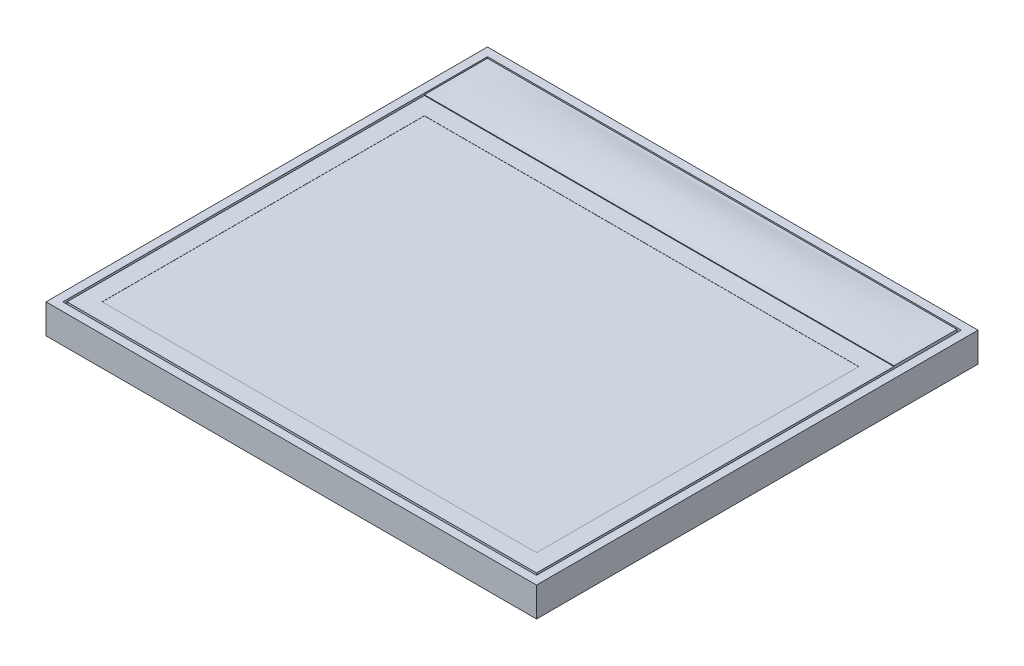
ISO-10303-21;
HEADER;
FILE_DESCRIPTION(('STEP AP214'),'2;1');
FILE_NAME('part.step','',(''),(''),'','','');
FILE_SCHEMA(('AUTOMOTIVE_DESIGN { 1 0 10303 214 1 1 1 1 }'));
ENDSEC;
DATA;
#1=APPLICATION_CONTEXT('core data for automotive mechanical design processes');
#2=APPLICATION_PROTOCOL_DEFINITION('international standard','automotive_design',2000,#1);
#3=PRODUCT_CONTEXT('',#1,'mechanical');
#4=PRODUCT('Part','Part','',(#3));
#5=PRODUCT_RELATED_PRODUCT_CATEGORY('part','',(#4));
#6=PRODUCT_DEFINITION_FORMATION('','',#4);
#7=PRODUCT_DEFINITION_CONTEXT('part definition',#1,'design');
#8=PRODUCT_DEFINITION('design','',#6,#7);
#9=PRODUCT_DEFINITION_SHAPE('','',#8);
#10=(LENGTH_UNIT() NAMED_UNIT(*) SI_UNIT(.MILLI.,.METRE.));
#11=(NAMED_UNIT(*) PLANE_ANGLE_UNIT() SI_UNIT($,.RADIAN.));
#12=(NAMED_UNIT(*) SI_UNIT($,.STERADIAN.) SOLID_ANGLE_UNIT());
#13=UNCERTAINTY_MEASURE_WITH_UNIT(LENGTH_MEASURE(1.E-05),#10,'distance_accuracy_value','');
#14=(GEOMETRIC_REPRESENTATION_CONTEXT(3) GLOBAL_UNCERTAINTY_ASSIGNED_CONTEXT((#13)) GLOBAL_UNIT_ASSIGNED_CONTEXT((#10,
#11,#12)) REPRESENTATION_CONTEXT('',''));
#15=CARTESIAN_POINT('',(0.,0.,0.));
#16=DIRECTION('',(0.,0.,1.));
#17=DIRECTION('',(1.,0.,0.));
#18=AXIS2_PLACEMENT_3D('',#15,#16,#17);
#19=CARTESIAN_POINT('',(-15.5,2.09,11.5));
#20=DIRECTION('',(0.,1.,0.));
#21=DIRECTION('',(0.,0.,1.));
#22=AXIS2_PLACEMENT_3D('',#19,#20,#21);
#23=PLANE('',#22);
#24=DIRECTION('',(0.,0.,-1.));
#25=VECTOR('',#24,1.);
#26=CARTESIAN_POINT('',(15.5,2.09,-11.5));
#27=LINE('',#26,#25);
#28=CARTESIAN_POINT('',(15.5,2.09,11.5));
#29=VERTEX_POINT('',#28);
#30=CARTESIAN_POINT('',(15.5,2.09,-11.5));
#31=VERTEX_POINT('',#30);
#32=EDGE_CURVE('E162',#29,#31,#27,.T.);
#33=ORIENTED_EDGE('',*,*,#32,.T.);
#34=DIRECTION('',(-1.,0.,0.));
#35=VECTOR('',#34,1.);
#36=CARTESIAN_POINT('',(-15.5,2.09,-11.5));
#37=LINE('',#36,#35);
#38=CARTESIAN_POINT('',(-15.5,2.09,-11.5));
#39=VERTEX_POINT('',#38);
#40=EDGE_CURVE('E143',#31,#39,#37,.T.);
#41=ORIENTED_EDGE('',*,*,#40,.T.);
#42=DIRECTION('',(0.,0.,1.));
#43=VECTOR('',#42,1.);
#44=CARTESIAN_POINT('',(-15.5,2.09,-11.5));
#45=LINE('',#44,#43);
#46=CARTESIAN_POINT('',(-15.5,2.09,11.5));
#47=VERTEX_POINT('',#46);
#48=EDGE_CURVE('E149',#39,#47,#45,.T.);
#49=ORIENTED_EDGE('',*,*,#48,.T.);
#50=DIRECTION('',(1.,0.,0.));
#51=VECTOR('',#50,1.);
#52=CARTESIAN_POINT('',(-15.5,2.09,11.5));
#53=LINE('',#52,#51);
#54=EDGE_CURVE('E209',#47,#29,#53,.T.);
#55=ORIENTED_EDGE('',*,*,#54,.T.);
#56=EDGE_LOOP('',(#33,#41,#49,#55));
#57=FACE_BOUND('',#56,.T.);
#58=ADVANCED_FACE('F17',(#57),#23,.T.);
#59=CARTESIAN_POINT('',(-16.75,2.15,-12.75));
#60=DIRECTION('',(0.,0.,-1.));
#61=DIRECTION('',(-1.,0.,0.));
#62=AXIS2_PLACEMENT_3D('',#59,#60,#61);
#63=PLANE('',#62);
#64=DIRECTION('',(0.,1.,0.));
#65=VECTOR('',#64,1.);
#66=CARTESIAN_POINT('',(16.75,2.15,-12.75));
#67=LINE('',#66,#65);
#68=CARTESIAN_POINT('',(16.75,2.15,-12.75));
#69=VERTEX_POINT('',#68);
#70=CARTESIAN_POINT('',(16.75,2.1,-12.75));
#71=VERTEX_POINT('',#70);
#72=EDGE_CURVE('E158',#69,#71,#67,.F.);
#73=ORIENTED_EDGE('',*,*,#72,.F.);
#74=DIRECTION('',(1.,0.,0.));
#75=VECTOR('',#74,1.);
#76=CARTESIAN_POINT('',(0.,2.15,-12.75));
#77=LINE('',#76,#75);
#78=CARTESIAN_POINT('',(-16.75,2.15,-12.75));
#79=VERTEX_POINT('',#78);
#80=EDGE_CURVE('E183',#79,#69,#77,.T.);
#81=ORIENTED_EDGE('',*,*,#80,.F.);
#82=DIRECTION('',(0.,1.,0.));
#83=VECTOR('',#82,1.);
#84=CARTESIAN_POINT('',(-16.75,2.15,-12.75));
#85=LINE('',#84,#83);
#86=CARTESIAN_POINT('',(-16.75,2.1,-12.75));
#87=VERTEX_POINT('',#86);
#88=EDGE_CURVE('E23',#87,#79,#85,.T.);
#89=ORIENTED_EDGE('',*,*,#88,.F.);
#90=DIRECTION('',(1.,0.,0.));
#91=VECTOR('',#90,1.);
#92=CARTESIAN_POINT('',(-16.75,2.1,-12.75));
#93=LINE('',#92,#91);
#94=EDGE_CURVE('E187',#71,#87,#93,.F.);
#95=ORIENTED_EDGE('',*,*,#94,.F.);
#96=EDGE_LOOP('',(#73,#81,#89,#95));
#97=FACE_BOUND('',#96,.T.);
#98=ADVANCED_FACE('F184',(#97),#63,.F.);
#99=CARTESIAN_POINT('',(-15.5,2.09,-11.5));
#100=DIRECTION('',(-1.,0.,0.));
#101=DIRECTION('',(0.,0.,1.));
#102=AXIS2_PLACEMENT_3D('',#99,#100,#101);
#103=PLANE('',#102);
#104=DIRECTION('',(0.,1.,0.));
#105=VECTOR('',#104,1.);
#106=CARTESIAN_POINT('',(-15.5,2.09,11.5));
#107=LINE('',#106,#105);
#108=CARTESIAN_POINT('',(-15.5,2.1,11.5));
#109=VERTEX_POINT('',#108);
#110=EDGE_CURVE('E154',#109,#47,#107,.F.);
#111=ORIENTED_EDGE('',*,*,#110,.T.);
#112=ORIENTED_EDGE('',*,*,#48,.F.);
#113=DIRECTION('',(0.,1.,0.));
#114=VECTOR('',#113,1.);
#115=CARTESIAN_POINT('',(-15.5,2.09,-11.5));
#116=LINE('',#115,#114);
#117=CARTESIAN_POINT('',(-15.5,2.1,-11.5));
#118=VERTEX_POINT('',#117);
#119=EDGE_CURVE('E152',#39,#118,#116,.T.);
#120=ORIENTED_EDGE('',*,*,#119,.T.);
#121=DIRECTION('',(0.,0.,1.));
#122=VECTOR('',#121,1.);
#123=CARTESIAN_POINT('',(-15.5,2.1,12.75));
#124=LINE('',#123,#122);
#125=EDGE_CURVE('E204',#109,#118,#124,.F.);
#126=ORIENTED_EDGE('',*,*,#125,.F.);
#127=EDGE_LOOP('',(#111,#112,#120,#126));
#128=FACE_BOUND('',#127,.T.);
#129=ADVANCED_FACE('F150',(#128),#103,.F.);
#130=CARTESIAN_POINT('',(-15.5,2.09,-11.5));
#131=DIRECTION('',(0.,0.,-1.));
#132=DIRECTION('',(-1.,0.,0.));
#133=AXIS2_PLACEMENT_3D('',#130,#131,#132);
#134=PLANE('',#133);
#135=ORIENTED_EDGE('',*,*,#119,.F.);
#136=ORIENTED_EDGE('',*,*,#40,.F.);
#137=DIRECTION('',(0.,1.,0.));
#138=VECTOR('',#137,1.);
#139=CARTESIAN_POINT('',(15.5,2.09,-11.5));
#140=LINE('',#139,#138);
#141=CARTESIAN_POINT('',(15.5,2.1,-11.5));
#142=VERTEX_POINT('',#141);
#143=EDGE_CURVE('E212',#31,#142,#140,.T.);
#144=ORIENTED_EDGE('',*,*,#143,.T.);
#145=DIRECTION('',(1.,0.,0.));
#146=VECTOR('',#145,1.);
#147=CARTESIAN_POINT('',(-16.75,2.1,-11.5));
#148=LINE('',#147,#146);
#149=EDGE_CURVE('E161',#118,#142,#148,.T.);
#150=ORIENTED_EDGE('',*,*,#149,.F.);
#151=EDGE_LOOP('',(#135,#136,#144,#150));
#152=FACE_BOUND('',#151,.T.);
#153=ADVANCED_FACE('F160',(#152),#134,.F.);
#154=CARTESIAN_POINT('',(15.5,2.09,-11.5));
#155=DIRECTION('',(1.,0.,0.));
#156=DIRECTION('',(0.,0.,-1.));
#157=AXIS2_PLACEMENT_3D('',#154,#155,#156);
#158=PLANE('',#157);
#159=ORIENTED_EDGE('',*,*,#143,.F.);
#160=ORIENTED_EDGE('',*,*,#32,.F.);
#161=DIRECTION('',(0.,1.,0.));
#162=VECTOR('',#161,1.);
#163=CARTESIAN_POINT('',(15.5,2.09,11.5));
#164=LINE('',#163,#162);
#165=CARTESIAN_POINT('',(15.5,2.1,11.5));
#166=VERTEX_POINT('',#165);
#167=EDGE_CURVE('E188',#29,#166,#164,.T.);
#168=ORIENTED_EDGE('',*,*,#167,.T.);
#169=DIRECTION('',(0.,0.,1.));
#170=VECTOR('',#169,1.);
#171=CARTESIAN_POINT('',(15.5,2.1,12.75));
#172=LINE('',#171,#170);
#173=EDGE_CURVE('E201',#142,#166,#172,.T.);
#174=ORIENTED_EDGE('',*,*,#173,.F.);
#175=EDGE_LOOP('',(#159,#160,#168,#174));
#176=FACE_BOUND('',#175,.T.);
#177=ADVANCED_FACE('F215',(#176),#158,.F.);
#178=CARTESIAN_POINT('',(-15.5,2.09,11.5));
#179=DIRECTION('',(0.,0.,1.));
#180=DIRECTION('',(1.,0.,0.));
#181=AXIS2_PLACEMENT_3D('',#178,#179,#180);
#182=PLANE('',#181);
#183=ORIENTED_EDGE('',*,*,#167,.F.);
#184=ORIENTED_EDGE('',*,*,#54,.F.);
#185=ORIENTED_EDGE('',*,*,#110,.F.);
#186=DIRECTION('',(1.,0.,0.));
#187=VECTOR('',#186,1.);
#188=CARTESIAN_POINT('',(-16.75,2.1,11.5));
#189=LINE('',#188,#187);
#190=EDGE_CURVE('E195',#166,#109,#189,.F.);
#191=ORIENTED_EDGE('',*,*,#190,.F.);
#192=EDGE_LOOP('',(#183,#184,#185,#191));
#193=FACE_BOUND('',#192,.T.);
#194=ADVANCED_FACE('F222',(#193),#182,.F.);
#195=CARTESIAN_POINT('',(-16.75,2.15,-17.25));
#196=CARTESIAN_POINT('',(-5.583333333333,2.15,-17.25));
#197=CARTESIAN_POINT('',(5.583333333333,2.15,-17.25));
#198=CARTESIAN_POINT('',(16.75,2.15,-17.25));
#199=CARTESIAN_POINT('',(-16.75,2.15,-15.75));
#200=CARTESIAN_POINT('',(-5.583333333333,2.683333333333,-15.75));
#201=CARTESIAN_POINT('',(5.583333333333,2.683333333333,-15.75));
#202=CARTESIAN_POINT('',(16.75,2.15,-15.75));
#203=CARTESIAN_POINT('',(-16.75,2.15,-14.25));
#204=CARTESIAN_POINT('',(-5.583333333333,2.683333333333,-14.25));
#205=CARTESIAN_POINT('',(5.583333333333,2.683333333333,-14.25));
#206=CARTESIAN_POINT('',(16.75,2.15,-14.25));
#207=CARTESIAN_POINT('',(-16.75,2.15,-12.75));
#208=CARTESIAN_POINT('',(-5.583333333333,2.15,-12.75));
#209=CARTESIAN_POINT('',(5.583333333333,2.15,-12.75));
#210=CARTESIAN_POINT('',(16.75,2.15,-12.75));
#211=B_SPLINE_SURFACE_WITH_KNOTS('',3,3,((#195,#196,#197,#198),(#199,#200,#201,#202),(#203,#204,
#205,#206),(#207,#208,#209,#210)),.UNSPECIFIED.,.F.,.F.,.F.,(4,4),(4,4),(0.,1.),(0.,1.),.UNSPECIFIED.);
#212=DIRECTION('',(-1.,0.,0.));
#213=VECTOR('',#212,1.);
#214=CARTESIAN_POINT('',(-16.75,2.15,-17.25));
#215=LINE('',#214,#213);
#216=CARTESIAN_POINT('',(-16.75,2.15,-17.25));
#217=VERTEX_POINT('',#216);
#218=CARTESIAN_POINT('',(16.75,2.15,-17.25));
#219=VERTEX_POINT('',#218);
#220=EDGE_CURVE('E191',#217,#219,#215,.F.);
#221=DIRECTION('',(0.,0.,1.));
#222=VECTOR('',#221,1.);
#223=CARTESIAN_POINT('',(-16.75,2.15,-17.25));
#224=LINE('',#223,#222);
#225=EDGE_CURVE('E176',#79,#217,#224,.F.);
#226=DIRECTION('',(0.,0.,-1.));
#227=VECTOR('',#226,1.);
#228=CARTESIAN_POINT('',(16.75,2.15,-17.25));
#229=LINE('',#228,#227);
#230=EDGE_CURVE('E517',#219,#69,#229,.F.);
#231=ORIENTED_EDGE('',*,*,#220,.F.);
#232=ORIENTED_EDGE('',*,*,#225,.F.);
#233=ORIENTED_EDGE('',*,*,#80,.T.);
#234=ORIENTED_EDGE('',*,*,#230,.F.);
#235=EDGE_LOOP('',(#231,#232,#233,#234));
#236=FACE_BOUND('',#235,.T.);
#237=ADVANCED_FACE('F19',(#236),#211,.T.);
#238=CARTESIAN_POINT('',(-16.75,2.1,12.75));
#239=DIRECTION('',(0.,1.,0.));
#240=DIRECTION('',(0.,0.,1.));
#241=AXIS2_PLACEMENT_3D('',#238,#239,#240);
#242=PLANE('',#241);
#243=ORIENTED_EDGE('',*,*,#173,.T.);
#244=ORIENTED_EDGE('',*,*,#190,.T.);
#245=ORIENTED_EDGE('',*,*,#125,.T.);
#246=ORIENTED_EDGE('',*,*,#149,.T.);
#247=EDGE_LOOP('',(#243,#244,#245,#246));
#248=FACE_BOUND('',#247,.T.);
#249=DIRECTION('',(1.,0.,0.));
#250=VECTOR('',#249,1.);
#251=CARTESIAN_POINT('',(-16.75,2.1,12.75));
#252=LINE('',#251,#250);
#253=CARTESIAN_POINT('',(16.75,2.1,12.75));
#254=VERTEX_POINT('',#253);
#255=CARTESIAN_POINT('',(-16.75,2.1,12.75));
#256=VERTEX_POINT('',#255);
#257=EDGE_CURVE('E503',#254,#256,#252,.F.);
#258=ORIENTED_EDGE('',*,*,#257,.F.);
#259=DIRECTION('',(0.,0.,-1.));
#260=VECTOR('',#259,1.);
#261=CARTESIAN_POINT('',(16.75,2.1,-17.25));
#262=LINE('',#261,#260);
#263=EDGE_CURVE('E515',#71,#254,#262,.F.);
#264=ORIENTED_EDGE('',*,*,#263,.F.);
#265=ORIENTED_EDGE('',*,*,#94,.T.);
#266=DIRECTION('',(0.,0.,1.));
#267=VECTOR('',#266,1.);
#268=CARTESIAN_POINT('',(-16.75,2.1,-17.25));
#269=LINE('',#268,#267);
#270=EDGE_CURVE('E179',#256,#87,#269,.F.);
#271=ORIENTED_EDGE('',*,*,#270,.F.);
#272=EDGE_LOOP('',(#258,#264,#265,#271));
#273=FACE_BOUND('',#272,.T.);
#274=ADVANCED_FACE('F219',(#248,#273),#242,.T.);
#275=CARTESIAN_POINT('',(-16.75,0.3,-17.25));
#276=DIRECTION('',(-1.,0.,0.));
#277=DIRECTION('',(0.,0.,1.));
#278=AXIS2_PLACEMENT_3D('',#275,#276,#277);
#279=PLANE('',#278);
#280=ORIENTED_EDGE('',*,*,#88,.T.);
#281=ORIENTED_EDGE('',*,*,#225,.T.);
#282=DIRECTION('',(0.,1.,0.));
#283=VECTOR('',#282,1.);
#284=CARTESIAN_POINT('',(-16.75,0.3,-17.25));
#285=LINE('',#284,#283);
#286=CARTESIAN_POINT('',(-16.75,0.6,-17.25));
#287=VERTEX_POINT('',#286);
#288=EDGE_CURVE('E192',#287,#217,#285,.T.);
#289=ORIENTED_EDGE('',*,*,#288,.F.);
#290=DIRECTION('',(0.,0.,1.));
#291=VECTOR('',#290,1.);
#292=CARTESIAN_POINT('',(-16.75,0.6,13.5));
#293=LINE('',#292,#291);
#294=CARTESIAN_POINT('',(-16.75,0.6,12.75));
#295=VERTEX_POINT('',#294);
#296=EDGE_CURVE('E499',#295,#287,#293,.F.);
#297=ORIENTED_EDGE('',*,*,#296,.F.);
#298=DIRECTION('',(0.,1.,0.));
#299=VECTOR('',#298,1.);
#300=CARTESIAN_POINT('',(-16.75,0.3,12.75));
#301=LINE('',#300,#299);
#302=EDGE_CURVE('E500',#256,#295,#301,.F.);
#303=ORIENTED_EDGE('',*,*,#302,.F.);
#304=ORIENTED_EDGE('',*,*,#270,.T.);
#305=EDGE_LOOP('',(#280,#281,#289,#297,#303,#304));
#306=FACE_BOUND('',#305,.T.);
#307=ADVANCED_FACE('F173',(#306),#279,.T.);
#308=CARTESIAN_POINT('',(-16.75,0.3,-17.25));
#309=DIRECTION('',(0.,0.,-1.));
#310=DIRECTION('',(-1.,0.,0.));
#311=AXIS2_PLACEMENT_3D('',#308,#309,#310);
#312=PLANE('',#311);
#313=ORIENTED_EDGE('',*,*,#288,.T.);
#314=ORIENTED_EDGE('',*,*,#220,.T.);
#315=DIRECTION('',(0.,1.,0.));
#316=VECTOR('',#315,1.);
#317=CARTESIAN_POINT('',(16.75,0.3,-17.25));
#318=LINE('',#317,#316);
#319=CARTESIAN_POINT('',(16.75,0.6,-17.25));
#320=VERTEX_POINT('',#319);
#321=EDGE_CURVE('E519',#320,#219,#318,.T.);
#322=ORIENTED_EDGE('',*,*,#321,.F.);
#323=DIRECTION('',(1.,0.,0.));
#324=VECTOR('',#323,1.);
#325=CARTESIAN_POINT('',(-17.5,0.6,-17.25));
#326=LINE('',#325,#324);
#327=EDGE_CURVE('E497',#287,#320,#326,.T.);
#328=ORIENTED_EDGE('',*,*,#327,.F.);
#329=EDGE_LOOP('',(#313,#314,#322,#328));
#330=FACE_BOUND('',#329,.T.);
#331=ADVANCED_FACE('F286',(#330),#312,.T.);
#332=CARTESIAN_POINT('',(16.75,0.3,-17.25));
#333=DIRECTION('',(1.,0.,0.));
#334=DIRECTION('',(0.,0.,-1.));
#335=AXIS2_PLACEMENT_3D('',#332,#333,#334);
#336=PLANE('',#335);
#337=ORIENTED_EDGE('',*,*,#72,.T.);
#338=ORIENTED_EDGE('',*,*,#263,.T.);
#339=DIRECTION('',(0.,1.,0.));
#340=VECTOR('',#339,1.);
#341=CARTESIAN_POINT('',(16.75,0.3,12.75));
#342=LINE('',#341,#340);
#343=CARTESIAN_POINT('',(16.75,0.6,12.75));
#344=VERTEX_POINT('',#343);
#345=EDGE_CURVE('E508',#344,#254,#342,.T.);
#346=ORIENTED_EDGE('',*,*,#345,.F.);
#347=DIRECTION('',(0.,0.,1.));
#348=VECTOR('',#347,1.);
#349=CARTESIAN_POINT('',(16.75,0.6,13.5));
#350=LINE('',#349,#348);
#351=EDGE_CURVE('E505',#320,#344,#350,.T.);
#352=ORIENTED_EDGE('',*,*,#351,.F.);
#353=ORIENTED_EDGE('',*,*,#321,.T.);
#354=ORIENTED_EDGE('',*,*,#230,.T.);
#355=EDGE_LOOP('',(#337,#338,#346,#352,#353,#354));
#356=FACE_BOUND('',#355,.T.);
#357=ADVANCED_FACE('F282',(#356),#336,.T.);
#358=CARTESIAN_POINT('',(-16.75,0.3,12.75));
#359=DIRECTION('',(0.,0.,1.));
#360=DIRECTION('',(1.,0.,0.));
#361=AXIS2_PLACEMENT_3D('',#358,#359,#360);
#362=PLANE('',#361);
#363=ORIENTED_EDGE('',*,*,#345,.T.);
#364=ORIENTED_EDGE('',*,*,#257,.T.);
#365=ORIENTED_EDGE('',*,*,#302,.T.);
#366=DIRECTION('',(1.,0.,0.));
#367=VECTOR('',#366,1.);
#368=CARTESIAN_POINT('',(-17.5,0.6,12.75));
#369=LINE('',#368,#367);
#370=EDGE_CURVE('E523',#344,#295,#369,.F.);
#371=ORIENTED_EDGE('',*,*,#370,.F.);
#372=EDGE_LOOP('',(#363,#364,#365,#371));
#373=FACE_BOUND('',#372,.T.);
#374=ADVANCED_FACE('F278',(#373),#362,.T.);
#375=CARTESIAN_POINT('',(-17.5,0.6,13.5));
#376=DIRECTION('',(0.,1.,0.));
#377=DIRECTION('',(0.,0.,1.));
#378=AXIS2_PLACEMENT_3D('',#375,#376,#377);
#379=PLANE('',#378);
#380=DIRECTION('',(0.,0.,1.));
#381=VECTOR('',#380,1.);
#382=CARTESIAN_POINT('',(16.9,0.6,-18.));
#383=LINE('',#382,#381);
#384=CARTESIAN_POINT('',(16.9,0.6,-17.4));
#385=VERTEX_POINT('',#384);
#386=CARTESIAN_POINT('',(16.9,0.6,12.9));
#387=VERTEX_POINT('',#386);
#388=EDGE_CURVE('E533',#385,#387,#383,.T.);
#389=ORIENTED_EDGE('',*,*,#388,.F.);
#390=DIRECTION('',(1.,0.,0.));
#391=VECTOR('',#390,1.);
#392=CARTESIAN_POINT('',(-17.5,0.6,-17.4));
#393=LINE('',#392,#391);
#394=CARTESIAN_POINT('',(-16.9,0.6,-17.4));
#395=VERTEX_POINT('',#394);
#396=EDGE_CURVE('E528',#395,#385,#393,.T.);
#397=ORIENTED_EDGE('',*,*,#396,.F.);
#398=DIRECTION('',(0.,0.,-1.));
#399=VECTOR('',#398,1.);
#400=CARTESIAN_POINT('',(-16.9,0.6,-18.));
#401=LINE('',#400,#399);
#402=CARTESIAN_POINT('',(-16.9,0.6,12.9));
#403=VERTEX_POINT('',#402);
#404=EDGE_CURVE('E524',#403,#395,#401,.T.);
#405=ORIENTED_EDGE('',*,*,#404,.F.);
#406=DIRECTION('',(-1.,0.,0.));
#407=VECTOR('',#406,1.);
#408=CARTESIAN_POINT('',(-17.5,0.6,12.9));
#409=LINE('',#408,#407);
#410=EDGE_CURVE('E538',#387,#403,#409,.T.);
#411=ORIENTED_EDGE('',*,*,#410,.F.);
#412=EDGE_LOOP('',(#389,#397,#405,#411));
#413=FACE_BOUND('',#412,.T.);
#414=ORIENTED_EDGE('',*,*,#351,.T.);
#415=ORIENTED_EDGE('',*,*,#370,.T.);
#416=ORIENTED_EDGE('',*,*,#296,.T.);
#417=ORIENTED_EDGE('',*,*,#327,.T.);
#418=EDGE_LOOP('',(#414,#415,#416,#417));
#419=FACE_BOUND('',#418,.T.);
#420=ADVANCED_FACE('F274',(#413,#419),#379,.T.);
#421=CARTESIAN_POINT('',(-16.9,2.1,-18.));
#422=DIRECTION('',(1.,0.,0.));
#423=DIRECTION('',(0.,0.,-1.));
#424=AXIS2_PLACEMENT_3D('',#421,#422,#423);
#425=PLANE('',#424);
#426=DIRECTION('',(0.,0.,1.));
#427=VECTOR('',#426,1.);
#428=CARTESIAN_POINT('',(-16.9,2.1,13.5));
#429=LINE('',#428,#427);
#430=CARTESIAN_POINT('',(-16.9,2.1,12.9));
#431=VERTEX_POINT('',#430);
#432=CARTESIAN_POINT('',(-16.9,2.1,-17.4));
#433=VERTEX_POINT('',#432);
#434=EDGE_CURVE('E545',#431,#433,#429,.F.);
#435=ORIENTED_EDGE('',*,*,#434,.F.);
#436=DIRECTION('',(0.,1.,0.));
#437=VECTOR('',#436,1.);
#438=CARTESIAN_POINT('',(-16.9,2.1,12.9));
#439=LINE('',#438,#437);
#440=EDGE_CURVE('E540',#403,#431,#439,.T.);
#441=ORIENTED_EDGE('',*,*,#440,.F.);
#442=ORIENTED_EDGE('',*,*,#404,.T.);
#443=DIRECTION('',(0.,1.,0.));
#444=VECTOR('',#443,1.);
#445=CARTESIAN_POINT('',(-16.9,2.1,-17.4));
#446=LINE('',#445,#444);
#447=EDGE_CURVE('E530',#433,#395,#446,.F.);
#448=ORIENTED_EDGE('',*,*,#447,.F.);
#449=EDGE_LOOP('',(#435,#441,#442,#448));
#450=FACE_BOUND('',#449,.T.);
#451=ADVANCED_FACE('F270',(#450),#425,.T.);
#452=CARTESIAN_POINT('',(-17.5,2.1,-17.4));
#453=DIRECTION('',(0.,0.,1.));
#454=DIRECTION('',(1.,0.,0.));
#455=AXIS2_PLACEMENT_3D('',#452,#453,#454);
#456=PLANE('',#455);
#457=DIRECTION('',(1.,0.,0.));
#458=VECTOR('',#457,1.);
#459=CARTESIAN_POINT('',(-17.5,2.1,-17.4));
#460=LINE('',#459,#458);
#461=CARTESIAN_POINT('',(16.9,2.1,-17.4));
#462=VERTEX_POINT('',#461);
#463=EDGE_CURVE('E547',#433,#462,#460,.T.);
#464=ORIENTED_EDGE('',*,*,#463,.F.);
#465=ORIENTED_EDGE('',*,*,#447,.T.);
#466=ORIENTED_EDGE('',*,*,#396,.T.);
#467=DIRECTION('',(0.,1.,0.));
#468=VECTOR('',#467,1.);
#469=CARTESIAN_POINT('',(16.9,2.1,-17.4));
#470=LINE('',#469,#468);
#471=EDGE_CURVE('E535',#462,#385,#470,.F.);
#472=ORIENTED_EDGE('',*,*,#471,.F.);
#473=EDGE_LOOP('',(#464,#465,#466,#472));
#474=FACE_BOUND('',#473,.T.);
#475=ADVANCED_FACE('F266',(#474),#456,.T.);
#476=CARTESIAN_POINT('',(16.9,2.1,-18.));
#477=DIRECTION('',(-1.,0.,0.));
#478=DIRECTION('',(0.,0.,1.));
#479=AXIS2_PLACEMENT_3D('',#476,#477,#478);
#480=PLANE('',#479);
#481=DIRECTION('',(0.,0.,1.));
#482=VECTOR('',#481,1.);
#483=CARTESIAN_POINT('',(16.9,2.1,13.5));
#484=LINE('',#483,#482);
#485=CARTESIAN_POINT('',(16.9,2.1,12.9));
#486=VERTEX_POINT('',#485);
#487=EDGE_CURVE('E549',#462,#486,#484,.T.);
#488=ORIENTED_EDGE('',*,*,#487,.F.);
#489=ORIENTED_EDGE('',*,*,#471,.T.);
#490=ORIENTED_EDGE('',*,*,#388,.T.);
#491=DIRECTION('',(0.,1.,0.));
#492=VECTOR('',#491,1.);
#493=CARTESIAN_POINT('',(16.9,2.1,12.9));
#494=LINE('',#493,#492);
#495=EDGE_CURVE('E542',#486,#387,#494,.F.);
#496=ORIENTED_EDGE('',*,*,#495,.F.);
#497=EDGE_LOOP('',(#488,#489,#490,#496));
#498=FACE_BOUND('',#497,.T.);
#499=ADVANCED_FACE('F262',(#498),#480,.T.);
#500=CARTESIAN_POINT('',(-17.5,2.1,12.9));
#501=DIRECTION('',(0.,0.,-1.));
#502=DIRECTION('',(-1.,0.,0.));
#503=AXIS2_PLACEMENT_3D('',#500,#501,#502);
#504=PLANE('',#503);
#505=DIRECTION('',(1.,0.,0.));
#506=VECTOR('',#505,1.);
#507=CARTESIAN_POINT('',(-17.5,2.1,12.9));
#508=LINE('',#507,#506);
#509=EDGE_CURVE('E551',#486,#431,#508,.F.);
#510=ORIENTED_EDGE('',*,*,#509,.F.);
#511=ORIENTED_EDGE('',*,*,#495,.T.);
#512=ORIENTED_EDGE('',*,*,#410,.T.);
#513=ORIENTED_EDGE('',*,*,#440,.T.);
#514=EDGE_LOOP('',(#510,#511,#512,#513));
#515=FACE_BOUND('',#514,.T.);
#516=ADVANCED_FACE('F258',(#515),#504,.T.);
#517=CARTESIAN_POINT('',(-17.5,2.1,13.5));
#518=DIRECTION('',(0.,1.,0.));
#519=DIRECTION('',(0.,0.,1.));
#520=AXIS2_PLACEMENT_3D('',#517,#518,#519);
#521=PLANE('',#520);
#522=DIRECTION('',(0.,0.,1.));
#523=VECTOR('',#522,1.);
#524=CARTESIAN_POINT('',(17.5,2.1,-18.));
#525=LINE('',#524,#523);
#526=CARTESIAN_POINT('',(17.5,2.1,13.5));
#527=VERTEX_POINT('',#526);
#528=CARTESIAN_POINT('',(17.5,2.1,-18.));
#529=VERTEX_POINT('',#528);
#530=EDGE_CURVE('E559',#527,#529,#525,.F.);
#531=ORIENTED_EDGE('',*,*,#530,.T.);
#532=DIRECTION('',(1.,0.,0.));
#533=VECTOR('',#532,1.);
#534=CARTESIAN_POINT('',(-17.5,2.1,-18.));
#535=LINE('',#534,#533);
#536=CARTESIAN_POINT('',(-17.5,2.1,-18.));
#537=VERTEX_POINT('',#536);
#538=EDGE_CURVE('E564',#529,#537,#535,.F.);
#539=ORIENTED_EDGE('',*,*,#538,.T.);
#540=DIRECTION('',(0.,0.,-1.));
#541=VECTOR('',#540,1.);
#542=CARTESIAN_POINT('',(-17.5,2.1,-18.));
#543=LINE('',#542,#541);
#544=CARTESIAN_POINT('',(-17.5,2.1,13.5));
#545=VERTEX_POINT('',#544);
#546=EDGE_CURVE('E567',#537,#545,#543,.F.);
#547=ORIENTED_EDGE('',*,*,#546,.T.);
#548=DIRECTION('',(-1.,0.,0.));
#549=VECTOR('',#548,1.);
#550=CARTESIAN_POINT('',(-17.5,2.1,13.5));
#551=LINE('',#550,#549);
#552=EDGE_CURVE('E554',#545,#527,#551,.F.);
#553=ORIENTED_EDGE('',*,*,#552,.T.);
#554=EDGE_LOOP('',(#531,#539,#547,#553));
#555=FACE_BOUND('',#554,.T.);
#556=ORIENTED_EDGE('',*,*,#487,.T.);
#557=ORIENTED_EDGE('',*,*,#509,.T.);
#558=ORIENTED_EDGE('',*,*,#434,.T.);
#559=ORIENTED_EDGE('',*,*,#463,.T.);
#560=EDGE_LOOP('',(#556,#557,#558,#559));
#561=FACE_BOUND('',#560,.T.);
#562=ADVANCED_FACE('F254',(#555,#561),#521,.T.);
#563=CARTESIAN_POINT('',(-17.5,2.1,13.5));
#564=DIRECTION('',(0.,0.,-1.));
#565=DIRECTION('',(-1.,0.,0.));
#566=AXIS2_PLACEMENT_3D('',#563,#564,#565);
#567=PLANE('',#566);
#568=DIRECTION('',(0.,1.,0.));
#569=VECTOR('',#568,1.);
#570=CARTESIAN_POINT('',(17.5,2.1,13.5));
#571=LINE('',#570,#569);
#572=CARTESIAN_POINT('',(17.5,0.,13.5));
#573=VERTEX_POINT('',#572);
#574=EDGE_CURVE('E556',#573,#527,#571,.T.);
#575=ORIENTED_EDGE('',*,*,#574,.T.);
#576=ORIENTED_EDGE('',*,*,#552,.F.);
#577=DIRECTION('',(0.,1.,0.));
#578=VECTOR('',#577,1.);
#579=CARTESIAN_POINT('',(-17.5,2.1,13.5));
#580=LINE('',#579,#578);
#581=CARTESIAN_POINT('',(-17.5,0.,13.5));
#582=VERTEX_POINT('',#581);
#583=EDGE_CURVE('E570',#545,#582,#580,.F.);
#584=ORIENTED_EDGE('',*,*,#583,.T.);
#585=DIRECTION('',(1.,0.,0.));
#586=VECTOR('',#585,1.);
#587=CARTESIAN_POINT('',(-17.5,0.,13.5));
#588=LINE('',#587,#586);
#589=EDGE_CURVE('E573',#582,#573,#588,.T.);
#590=ORIENTED_EDGE('',*,*,#589,.T.);
#591=EDGE_LOOP('',(#575,#576,#584,#590));
#592=FACE_BOUND('',#591,.T.);
#593=ADVANCED_FACE('F250',(#592),#567,.F.);
#594=CARTESIAN_POINT('',(17.5,2.1,-18.));
#595=DIRECTION('',(-1.,0.,0.));
#596=DIRECTION('',(0.,0.,1.));
#597=AXIS2_PLACEMENT_3D('',#594,#595,#596);
#598=PLANE('',#597);
#599=DIRECTION('',(0.,1.,0.));
#600=VECTOR('',#599,1.);
#601=CARTESIAN_POINT('',(17.5,2.1,-18.));
#602=LINE('',#601,#600);
#603=CARTESIAN_POINT('',(17.5,0.,-18.));
#604=VERTEX_POINT('',#603);
#605=EDGE_CURVE('E561',#604,#529,#602,.T.);
#606=ORIENTED_EDGE('',*,*,#605,.T.);
#607=ORIENTED_EDGE('',*,*,#530,.F.);
#608=ORIENTED_EDGE('',*,*,#574,.F.);
#609=DIRECTION('',(0.,0.,1.));
#610=VECTOR('',#609,1.);
#611=CARTESIAN_POINT('',(17.5,0.,13.5));
#612=LINE('',#611,#610);
#613=EDGE_CURVE('E576',#573,#604,#612,.F.);
#614=ORIENTED_EDGE('',*,*,#613,.T.);
#615=EDGE_LOOP('',(#606,#607,#608,#614));
#616=FACE_BOUND('',#615,.T.);
#617=ADVANCED_FACE('F246',(#616),#598,.F.);
#618=CARTESIAN_POINT('',(-17.5,2.1,-18.));
#619=DIRECTION('',(0.,0.,1.));
#620=DIRECTION('',(1.,0.,0.));
#621=AXIS2_PLACEMENT_3D('',#618,#619,#620);
#622=PLANE('',#621);
#623=DIRECTION('',(0.,1.,0.));
#624=VECTOR('',#623,1.);
#625=CARTESIAN_POINT('',(-17.5,2.1,-18.));
#626=LINE('',#625,#624);
#627=CARTESIAN_POINT('',(-17.5,0.,-18.));
#628=VERTEX_POINT('',#627);
#629=EDGE_CURVE('E37',#628,#537,#626,.T.);
#630=ORIENTED_EDGE('',*,*,#629,.T.);
#631=ORIENTED_EDGE('',*,*,#538,.F.);
#632=ORIENTED_EDGE('',*,*,#605,.F.);
#633=DIRECTION('',(1.,0.,0.));
#634=VECTOR('',#633,1.);
#635=CARTESIAN_POINT('',(-17.5,0.,-18.));
#636=LINE('',#635,#634);
#637=EDGE_CURVE('E29',#604,#628,#636,.F.);
#638=ORIENTED_EDGE('',*,*,#637,.T.);
#639=EDGE_LOOP('',(#630,#631,#632,#638));
#640=FACE_BOUND('',#639,.T.);
#641=ADVANCED_FACE('F240',(#640),#622,.F.);
#642=CARTESIAN_POINT('',(-17.5,2.1,-18.));
#643=DIRECTION('',(1.,0.,0.));
#644=DIRECTION('',(0.,0.,-1.));
#645=AXIS2_PLACEMENT_3D('',#642,#643,#644);
#646=PLANE('',#645);
#647=ORIENTED_EDGE('',*,*,#583,.F.);
#648=ORIENTED_EDGE('',*,*,#546,.F.);
#649=ORIENTED_EDGE('',*,*,#629,.F.);
#650=DIRECTION('',(0.,0.,1.));
#651=VECTOR('',#650,1.);
#652=CARTESIAN_POINT('',(-17.5,0.,13.5));
#653=LINE('',#652,#651);
#654=EDGE_CURVE('E11',#628,#582,#653,.T.);
#655=ORIENTED_EDGE('',*,*,#654,.T.);
#656=EDGE_LOOP('',(#647,#648,#649,#655));
#657=FACE_BOUND('',#656,.T.);
#658=ADVANCED_FACE('F234',(#657),#646,.F.);
#659=CARTESIAN_POINT('',(-17.5,0.,13.5));
#660=DIRECTION('',(0.,1.,0.));
#661=DIRECTION('',(0.,0.,1.));
#662=AXIS2_PLACEMENT_3D('',#659,#660,#661);
#663=PLANE('',#662);
#664=ORIENTED_EDGE('',*,*,#637,.F.);
#665=ORIENTED_EDGE('',*,*,#613,.F.);
#666=ORIENTED_EDGE('',*,*,#589,.F.);
#667=ORIENTED_EDGE('',*,*,#654,.F.);
#668=EDGE_LOOP('',(#664,#665,#666,#667));
#669=FACE_BOUND('',#668,.T.);
#670=ADVANCED_FACE('F232',(#669),#663,.F.);
#671=CLOSED_SHELL('',(#58,#98,#129,#153,#177,#194,#237,#274,#307,#331,#357,#374,#420,#451,#475,
#499,#516,#562,#593,#617,#641,#658,#670));
#672=MANIFOLD_SOLID_BREP('B1',#671);
#673=ADVANCED_BREP_SHAPE_REPRESENTATION('',(#18,#672),#14);
#674=SHAPE_DEFINITION_REPRESENTATION(#9,#673);
ENDSEC;
END-ISO-10303-21;
